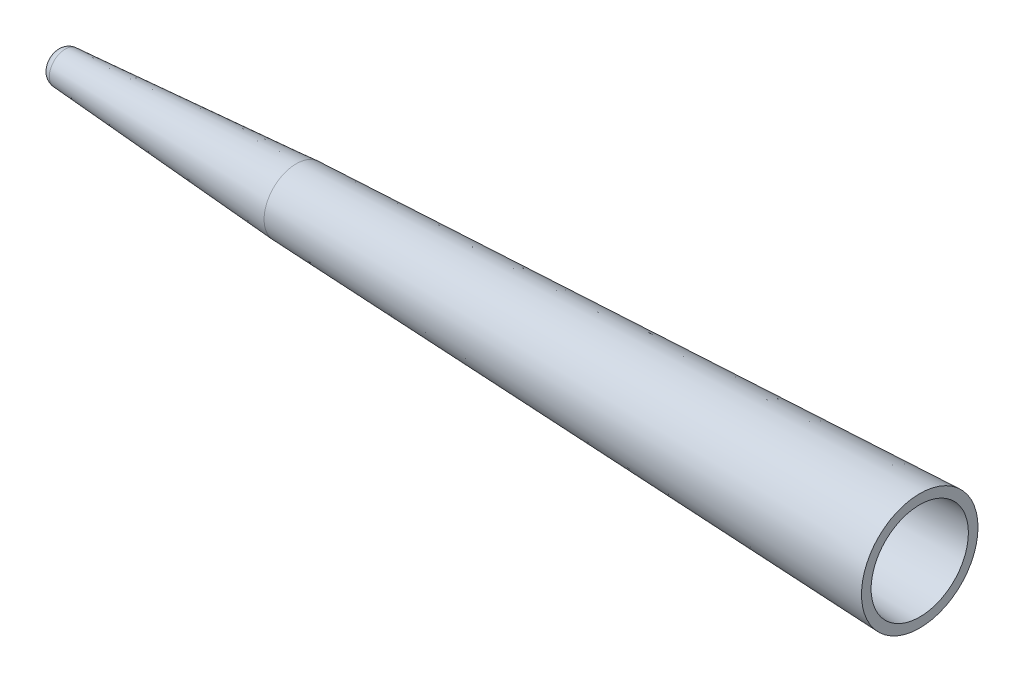
ISO-10303-21;
HEADER;
FILE_DESCRIPTION(('STEP AP214'),'2;1');
FILE_NAME('part.step','',(''),(''),'','','');
FILE_SCHEMA(('AUTOMOTIVE_DESIGN { 1 0 10303 214 1 1 1 1 }'));
ENDSEC;
DATA;
#1=APPLICATION_CONTEXT('core data for automotive mechanical design processes');
#2=APPLICATION_PROTOCOL_DEFINITION('international standard','automotive_design',2000,#1);
#3=PRODUCT_CONTEXT('',#1,'mechanical');
#4=PRODUCT('Part','Part','',(#3));
#5=PRODUCT_RELATED_PRODUCT_CATEGORY('part','',(#4));
#6=PRODUCT_DEFINITION_FORMATION('','',#4);
#7=PRODUCT_DEFINITION_CONTEXT('part definition',#1,'design');
#8=PRODUCT_DEFINITION('design','',#6,#7);
#9=PRODUCT_DEFINITION_SHAPE('','',#8);
#10=(LENGTH_UNIT() NAMED_UNIT(*) SI_UNIT(.MILLI.,.METRE.));
#11=(NAMED_UNIT(*) PLANE_ANGLE_UNIT() SI_UNIT($,.RADIAN.));
#12=(NAMED_UNIT(*) SI_UNIT($,.STERADIAN.) SOLID_ANGLE_UNIT());
#13=UNCERTAINTY_MEASURE_WITH_UNIT(LENGTH_MEASURE(1.E-05),#10,'distance_accuracy_value','');
#14=(GEOMETRIC_REPRESENTATION_CONTEXT(3) GLOBAL_UNCERTAINTY_ASSIGNED_CONTEXT((#13)) GLOBAL_UNIT_ASSIGNED_CONTEXT((#10,
#11,#12)) REPRESENTATION_CONTEXT('',''));
#15=CARTESIAN_POINT('',(0.,0.,0.));
#16=DIRECTION('',(0.,0.,1.));
#17=DIRECTION('',(1.,0.,0.));
#18=AXIS2_PLACEMENT_3D('',#15,#16,#17);
#19=CARTESIAN_POINT('',(50.,6.69634059717554,0.));
#20=DIRECTION('',(-1.,0.,0.));
#21=DIRECTION('',(0.,0.,1.));
#22=AXIS2_PLACEMENT_3D('',#19,#20,#21);
#23=PLANE('',#22);
#24=CARTESIAN_POINT('',(50.,0.,0.));
#25=DIRECTION('',(1.,0.,0.));
#26=DIRECTION('',(0.,0.,-1.));
#27=AXIS2_PLACEMENT_3D('',#24,#25,#26);
#28=CIRCLE('',#27,4.69458471716816);
#29=CARTESIAN_POINT('',(50.,0.,-4.69458471716816));
#30=VERTEX_POINT('',#29);
#31=EDGE_CURVE('E11',#30,#30,#28,.T.);
#32=ORIENTED_EDGE('',*,*,#31,.T.);
#33=EDGE_LOOP('',(#32));
#34=FACE_BOUND('',#33,.T.);
#35=CARTESIAN_POINT('',(50.,0.,0.));
#36=DIRECTION('',(1.,0.,0.));
#37=DIRECTION('',(0.,0.,-1.));
#38=AXIS2_PLACEMENT_3D('',#35,#36,#37);
#39=CIRCLE('',#38,6.69634059717554);
#40=CARTESIAN_POINT('',(50.,0.,-6.69634059717554));
#41=VERTEX_POINT('',#40);
#42=EDGE_CURVE('E63',#41,#41,#39,.T.);
#43=ORIENTED_EDGE('',*,*,#42,.F.);
#44=EDGE_LOOP('',(#43));
#45=FACE_BOUND('',#44,.T.);
#46=ADVANCED_FACE('F49',(#34,#45),#23,.T.);
#47=CARTESIAN_POINT('',(50.,0.,0.));
#48=DIRECTION('',(1.,0.,0.));
#49=DIRECTION('',(0.,0.,-1.));
#50=AXIS2_PLACEMENT_3D('',#47,#48,#49);
#51=CONICAL_SURFACE('',#50,4.69458471716816,0.0418879020478642);
#52=CARTESIAN_POINT('',(180.,0.,0.));
#53=DIRECTION('',(1.,0.,0.));
#54=DIRECTION('',(0.,0.,-1.));
#55=AXIS2_PLACEMENT_3D('',#52,#53,#54);
#56=CIRCLE('',#55,10.1431990624708);
#57=CARTESIAN_POINT('',(180.,0.,-10.1431990624708));
#58=VERTEX_POINT('',#57);
#59=EDGE_CURVE('E55',#58,#58,#56,.T.);
#60=ORIENTED_EDGE('',*,*,#59,.T.);
#61=EDGE_LOOP('',(#60));
#62=FACE_BOUND('',#61,.T.);
#63=ORIENTED_EDGE('',*,*,#31,.F.);
#64=EDGE_LOOP('',(#63));
#65=FACE_BOUND('',#64,.T.);
#66=ADVANCED_FACE('F73',(#62,#65),#51,.F.);
#67=CARTESIAN_POINT('',(180.,10.1431990624708,0.));
#68=DIRECTION('',(1.,0.,0.));
#69=DIRECTION('',(0.,0.,-1.));
#70=AXIS2_PLACEMENT_3D('',#67,#68,#69);
#71=PLANE('',#70);
#72=CARTESIAN_POINT('',(180.,0.,0.));
#73=DIRECTION('',(1.,0.,0.));
#74=DIRECTION('',(0.,0.,-1.));
#75=AXIS2_PLACEMENT_3D('',#72,#73,#74);
#76=CIRCLE('',#75,12.1449549424782);
#77=CARTESIAN_POINT('',(180.,0.,-12.1449549424782));
#78=VERTEX_POINT('',#77);
#79=EDGE_CURVE('E59',#78,#78,#76,.T.);
#80=ORIENTED_EDGE('',*,*,#79,.T.);
#81=EDGE_LOOP('',(#80));
#82=FACE_BOUND('',#81,.T.);
#83=ORIENTED_EDGE('',*,*,#59,.F.);
#84=EDGE_LOOP('',(#83));
#85=FACE_BOUND('',#84,.T.);
#86=ADVANCED_FACE('F77',(#82,#85),#71,.T.);
#87=CARTESIAN_POINT('',(180.,0.,0.));
#88=DIRECTION('',(1.,0.,0.));
#89=DIRECTION('',(0.,0.,-1.));
#90=AXIS2_PLACEMENT_3D('',#87,#88,#89);
#91=CONICAL_SURFACE('',#90,12.1449549424782,0.0418879020478642);
#92=ORIENTED_EDGE('',*,*,#42,.T.);
#93=EDGE_LOOP('',(#92));
#94=FACE_BOUND('',#93,.T.);
#95=ORIENTED_EDGE('',*,*,#79,.F.);
#96=EDGE_LOOP('',(#95));
#97=FACE_BOUND('',#96,.T.);
#98=ADVANCED_FACE('F69',(#94,#97),#91,.T.);
#99=CLOSED_SHELL('',(#46,#66,#86,#98));
#100=MANIFOLD_SOLID_BREP('B2',#99);
#101=CARTESIAN_POINT('',(1.99026806874157,0.,0.));
#102=DIRECTION('',(-1.,0.,0.));
#103=DIRECTION('',(0.,0.,1.));
#104=AXIS2_PLACEMENT_3D('',#101,#102,#103);
#105=DEGENERATE_TOROIDAL_SURFACE('',#104,1.33917310096007,1.99512810051965,.T.);
#106=CARTESIAN_POINT('',(0.,0.,0.));
#107=DIRECTION('',(-1.,0.,0.));
#108=DIRECTION('',(0.,0.,1.));
#109=AXIS2_PLACEMENT_3D('',#106,#107,#108);
#110=CIRCLE('',#109,1.2);
#111=CARTESIAN_POINT('',(0.,0.,-1.2));
#112=VERTEX_POINT('',#111);
#113=EDGE_CURVE('E133',#112,#112,#110,.T.);
#114=ORIENTED_EDGE('',*,*,#113,.F.);
#115=EDGE_LOOP('',(#114));
#116=FACE_BOUND('',#115,.T.);
#117=CARTESIAN_POINT('',(1.85109496778151,0.,0.));
#118=DIRECTION('',(-1.,0.,0.));
#119=DIRECTION('',(0.,0.,1.));
#120=AXIS2_PLACEMENT_3D('',#117,#118,#119);
#121=CIRCLE('',#120,3.32944116970164);
#122=CARTESIAN_POINT('',(1.85109496778151,0.,3.32944116970164));
#123=VERTEX_POINT('',#122);
#124=EDGE_CURVE('E48',#123,#123,#121,.T.);
#125=ORIENTED_EDGE('',*,*,#124,.T.);
#126=EDGE_LOOP('',(#125));
#127=FACE_BOUND('',#126,.T.);
#128=ADVANCED_FACE('F119',(#116,#127),#105,.T.);
#129=CARTESIAN_POINT('',(50.,0.,0.));
#130=DIRECTION('',(1.,0.,0.));
#131=DIRECTION('',(0.,0.,-1.));
#132=AXIS2_PLACEMENT_3D('',#129,#130,#131);
#133=CONICAL_SURFACE('',#132,6.69634059717554,0.0698131700797735);
#134=ORIENTED_EDGE('',*,*,#124,.F.);
#135=EDGE_LOOP('',(#134));
#136=FACE_BOUND('',#135,.T.);
#137=CARTESIAN_POINT('',(50.,0.,0.));
#138=DIRECTION('',(-1.,0.,0.));
#139=DIRECTION('',(0.,0.,1.));
#140=AXIS2_PLACEMENT_3D('',#137,#138,#139);
#141=CIRCLE('',#140,6.69634059717554);
#142=CARTESIAN_POINT('',(50.,0.,6.69634059717554));
#143=VERTEX_POINT('',#142);
#144=EDGE_CURVE('E125',#143,#143,#141,.T.);
#145=ORIENTED_EDGE('',*,*,#144,.T.);
#146=EDGE_LOOP('',(#145));
#147=FACE_BOUND('',#146,.T.);
#148=ADVANCED_FACE('F142',(#136,#147),#133,.T.);
#149=CARTESIAN_POINT('',(50.,6.69634059717554,0.));
#150=DIRECTION('',(-1.,0.,0.));
#151=DIRECTION('',(0.,0.,1.));
#152=AXIS2_PLACEMENT_3D('',#149,#150,#151);
#153=PLANE('',#152);
#154=ORIENTED_EDGE('',*,*,#144,.F.);
#155=EDGE_LOOP('',(#154));
#156=FACE_BOUND('',#155,.T.);
#157=CARTESIAN_POINT('',(50.,0.,0.));
#158=DIRECTION('',(-1.,0.,0.));
#159=DIRECTION('',(0.,0.,1.));
#160=AXIS2_PLACEMENT_3D('',#157,#158,#159);
#161=CIRCLE('',#160,4.69634059717554);
#162=CARTESIAN_POINT('',(50.,0.,-4.69634059717554));
#163=VERTEX_POINT('',#162);
#164=EDGE_CURVE('E129',#163,#163,#161,.T.);
#165=ORIENTED_EDGE('',*,*,#164,.T.);
#166=EDGE_LOOP('',(#165));
#167=FACE_BOUND('',#166,.T.);
#168=ADVANCED_FACE('F146',(#156,#167),#153,.F.);
#169=CARTESIAN_POINT('',(0.,0.,0.));
#170=DIRECTION('',(1.,0.,0.));
#171=DIRECTION('',(0.,0.,-1.));
#172=AXIS2_PLACEMENT_3D('',#169,#170,#171);
#173=CONICAL_SURFACE('',#172,1.2,0.0698131700797735);
#174=CARTESIAN_POINT('',(50.,0.,-4.69634059717554));
#175=CARTESIAN_POINT('',(49.4791666666667,0.,-4.65992038262162));
#176=CARTESIAN_POINT('',(48.9583333333333,0.,-4.62350016806771));
#177=CARTESIAN_POINT('',(47.9166666666667,0.,-4.55065973895989));
#178=CARTESIAN_POINT('',(47.3958333333333,0.,-4.51423952440598));
#179=CARTESIAN_POINT('',(46.3541666666667,0.,-4.44139909529815));
#180=CARTESIAN_POINT('',(45.8333333333333,0.,-4.40497888074424));
#181=CARTESIAN_POINT('',(44.7916666666667,0.,-4.33213845163642));
#182=CARTESIAN_POINT('',(44.2708333333333,0.,-4.29571823708251));
#183=CARTESIAN_POINT('',(43.2291666666667,0.,-4.22287780797468));
#184=CARTESIAN_POINT('',(42.7083333333333,0.,-4.18645759342077));
#185=CARTESIAN_POINT('',(41.6666666666667,0.,-4.11361716431295));
#186=CARTESIAN_POINT('',(41.1458333333333,0.,-4.07719694975904));
#187=CARTESIAN_POINT('',(40.1041666666667,0.,-4.00435652065121));
#188=CARTESIAN_POINT('',(39.5833333333333,0.,-3.9679363060973));
#189=CARTESIAN_POINT('',(38.5416666666667,0.,-3.89509587698948));
#190=CARTESIAN_POINT('',(38.0208333333333,0.,-3.85867566243556));
#191=CARTESIAN_POINT('',(36.9791666666667,0.,-3.78583523332774));
#192=CARTESIAN_POINT('',(36.4583333333333,0.,-3.74941501877383));
#193=CARTESIAN_POINT('',(35.4166666666667,0.,-3.67657458966601));
#194=CARTESIAN_POINT('',(34.8958333333333,0.,-3.64015437511209));
#195=CARTESIAN_POINT('',(33.8541666666667,0.,-3.56731394600427));
#196=CARTESIAN_POINT('',(33.3333333333333,0.,-3.53089373145036));
#197=CARTESIAN_POINT('',(32.2916666666667,0.,-3.45805330234253));
#198=CARTESIAN_POINT('',(31.7708333333333,0.,-3.42163308778862));
#199=CARTESIAN_POINT('',(30.7291666666667,0.,-3.3487926586808));
#200=CARTESIAN_POINT('',(30.2083333333333,0.,-3.31237244412689));
#201=CARTESIAN_POINT('',(29.1666666666667,0.,-3.23953201501906));
#202=CARTESIAN_POINT('',(28.6458333333333,0.,-3.20311180046515));
#203=CARTESIAN_POINT('',(27.6041666666667,0.,-3.13027137135733));
#204=CARTESIAN_POINT('',(27.0833333333333,0.,-3.09385115680342));
#205=CARTESIAN_POINT('',(26.0416666666667,0.,-3.02101072769559));
#206=CARTESIAN_POINT('',(25.5208333333333,0.,-2.98459051314168));
#207=CARTESIAN_POINT('',(24.4791666666667,0.,-2.91175008403386));
#208=CARTESIAN_POINT('',(23.9583333333333,0.,-2.87532986947995));
#209=CARTESIAN_POINT('',(22.9166666666667,0.,-2.80248944037212));
#210=CARTESIAN_POINT('',(22.3958333333333,0.,-2.76606922581821));
#211=CARTESIAN_POINT('',(21.3541666666667,0.,-2.69322879671039));
#212=CARTESIAN_POINT('',(20.8333333333333,0.,-2.65680858215647));
#213=CARTESIAN_POINT('',(19.7916666666667,0.,-2.58396815304865));
#214=CARTESIAN_POINT('',(19.2708333333333,0.,-2.54754793849474));
#215=CARTESIAN_POINT('',(18.2291666666667,0.,-2.47470750938691));
#216=CARTESIAN_POINT('',(17.7083333333333,0.,-2.438287294833));
#217=CARTESIAN_POINT('',(16.6666666666667,0.,-2.36544686572518));
#218=CARTESIAN_POINT('',(16.1458333333333,0.,-2.32902665117127));
#219=CARTESIAN_POINT('',(15.1041666666667,0.,-2.25618622206344));
#220=CARTESIAN_POINT('',(14.5833333333333,0.,-2.21976600750953));
#221=CARTESIAN_POINT('',(13.5416666666667,0.,-2.14692557840171));
#222=CARTESIAN_POINT('',(13.0208333333333,0.,-2.1105053638478));
#223=CARTESIAN_POINT('',(11.9791666666667,0.,-2.03766493473997));
#224=CARTESIAN_POINT('',(11.4583333333333,0.,-2.00124472018606));
#225=CARTESIAN_POINT('',(10.4166666666667,0.,-1.92840429107824));
#226=CARTESIAN_POINT('',(9.89583333333334,0.,-1.89198407652432));
#227=CARTESIAN_POINT('',(8.85416666666667,0.,-1.8191436474165));
#228=CARTESIAN_POINT('',(8.33333333333334,0.,-1.78272343286259));
#229=CARTESIAN_POINT('',(7.29166666666667,0.,-1.70988300375477));
#230=CARTESIAN_POINT('',(6.77083333333334,0.,-1.67346278920085));
#231=CARTESIAN_POINT('',(5.72916666666667,0.,-1.60062236009303));
#232=CARTESIAN_POINT('',(5.20833333333333,0.,-1.56420214553912));
#233=CARTESIAN_POINT('',(4.16666666666667,0.,-1.49136171643129));
#234=CARTESIAN_POINT('',(3.64583333333334,0.,-1.45494150187738));
#235=CARTESIAN_POINT('',(2.60416666666667,0.,-1.38210107276956));
#236=CARTESIAN_POINT('',(2.08333333333334,0.,-1.34568085821565));
#237=CARTESIAN_POINT('',(1.04166666666667,0.,-1.27284042910782));
#238=CARTESIAN_POINT('',(0.520833333333338,0.,-1.23642021455391));
#239=CARTESIAN_POINT('',(0.,0.,-1.2));
#240=B_SPLINE_CURVE_WITH_KNOTS('',3,(#174,#175,#176,#177,#178,#179,#180,#181,#182,#183,#184,
#185,#186,#187,#188,#189,#190,#191,#192,#193,#194,#195,#196,#197,#198,#199,#200,#201,#202,#203,
#204,#205,#206,#207,#208,#209,#210,#211,#212,#213,#214,#215,#216,#217,#218,#219,#220,#221,#222,
#223,#224,#225,#226,#227,#228,#229,#230,#231,#232,#233,#234,#235,#236,#237,#238,#239),
.UNSPECIFIED.,.F.,.F.,(4,2,2,2,2,2,2,2,2,2,2,2,2,2,2,2,2,2,2,2,2,2,2,2,2,2,2,2,2,2,2,2,4),(0.,
1.56631546575183,3.13263093150367,4.69894639725549,6.26526186300732,7.83157732875916,
9.39789279451098,10.9642082602628,12.5305237260147,14.0968391917665,15.6631546575183,
17.2294701232701,18.795785589022,20.3621010547738,21.9284165205256,23.4947319862775,
25.0610474520293,26.6273629177811,28.193678383533,29.7599938492848,31.3263093150366,
32.8926247807885,34.4589402465403,36.0252557122921,37.5915711780439,39.1578866437958,
40.7242021095476,42.2905175752994,43.8568330410513,45.4231485068031,46.9894639725549,
48.5557794383068,50.1220949040586),.UNSPECIFIED.);
#241=EDGE_CURVE('BSEAM139',#163,#112,#240,.T.);
#242=ORIENTED_EDGE('',*,*,#164,.F.);
#243=ORIENTED_EDGE('',*,*,#113,.T.);
#244=ORIENTED_EDGE('',*,*,#241,.T.);
#245=ORIENTED_EDGE('',*,*,#241,.F.);
#246=EDGE_LOOP('',(#242,#244,#243,#245));
#247=FACE_BOUND('',#246,.T.);
#248=ADVANCED_FACE('F139',(#247),#173,.F.);
#249=CLOSED_SHELL('',(#128,#148,#168,#248));
#250=MANIFOLD_SOLID_BREP('B6',#249);
#251=ADVANCED_BREP_SHAPE_REPRESENTATION('',(#18,#100,#250),#14);
#252=SHAPE_DEFINITION_REPRESENTATION(#9,#251);
ENDSEC;
END-ISO-10303-21;
